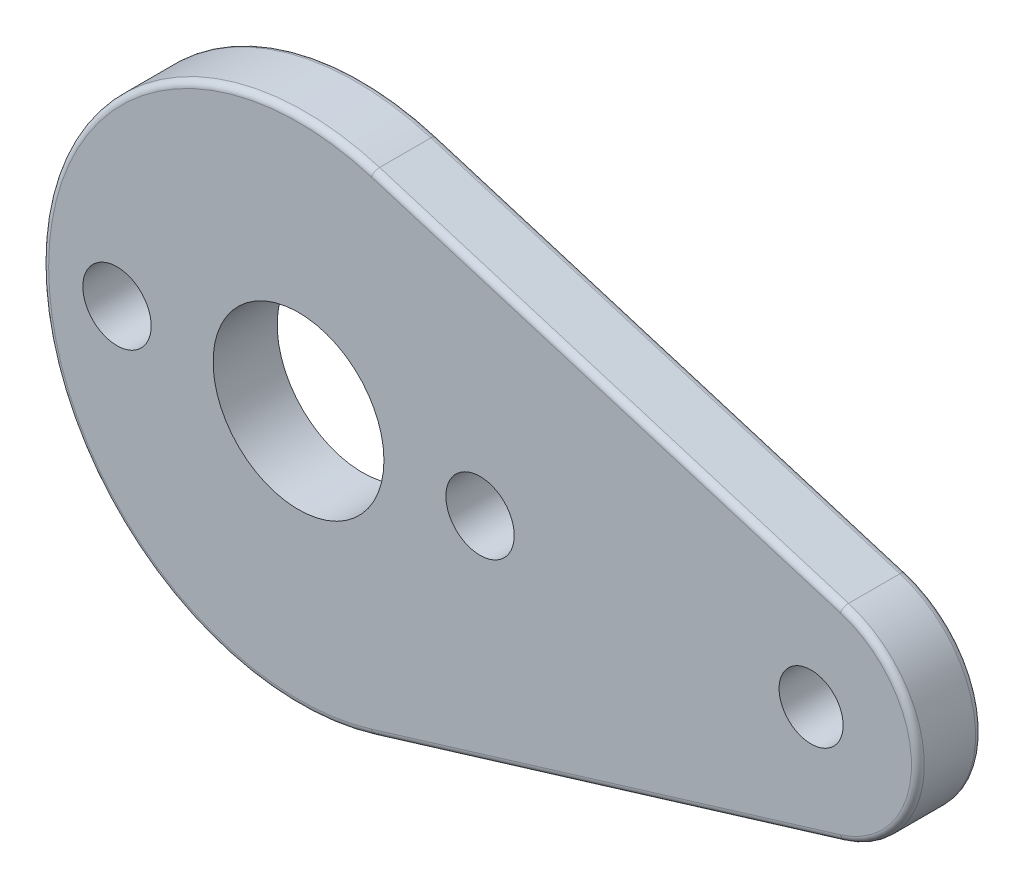
ISO-10303-21;
HEADER;
FILE_DESCRIPTION(('STEP AP214'),'2;1');
FILE_NAME('part.step','',(''),(''),'','','');
FILE_SCHEMA(('AUTOMOTIVE_DESIGN { 1 0 10303 214 1 1 1 1 }'));
ENDSEC;
DATA;
#1=APPLICATION_CONTEXT('core data for automotive mechanical design processes');
#2=APPLICATION_PROTOCOL_DEFINITION('international standard','automotive_design',2000,#1);
#3=PRODUCT_CONTEXT('',#1,'mechanical');
#4=PRODUCT('Part','Part','',(#3));
#5=PRODUCT_RELATED_PRODUCT_CATEGORY('part','',(#4));
#6=PRODUCT_DEFINITION_FORMATION('','',#4);
#7=PRODUCT_DEFINITION_CONTEXT('part definition',#1,'design');
#8=PRODUCT_DEFINITION('design','',#6,#7);
#9=PRODUCT_DEFINITION_SHAPE('','',#8);
#10=(LENGTH_UNIT() NAMED_UNIT(*) SI_UNIT(.MILLI.,.METRE.));
#11=(NAMED_UNIT(*) PLANE_ANGLE_UNIT() SI_UNIT($,.RADIAN.));
#12=(NAMED_UNIT(*) SI_UNIT($,.STERADIAN.) SOLID_ANGLE_UNIT());
#13=UNCERTAINTY_MEASURE_WITH_UNIT(LENGTH_MEASURE(1.E-05),#10,'distance_accuracy_value','');
#14=(GEOMETRIC_REPRESENTATION_CONTEXT(3) GLOBAL_UNCERTAINTY_ASSIGNED_CONTEXT((#13)) GLOBAL_UNIT_ASSIGNED_CONTEXT((#10,
#11,#12)) REPRESENTATION_CONTEXT('',''));
#15=CARTESIAN_POINT('',(0.,0.,0.));
#16=DIRECTION('',(0.,0.,1.));
#17=DIRECTION('',(1.,0.,0.));
#18=AXIS2_PLACEMENT_3D('',#15,#16,#17);
#19=CARTESIAN_POINT('',(0.,0.,3.));
#20=DIRECTION('',(0.,0.,-1.));
#21=DIRECTION('',(-1.,0.,0.));
#22=AXIS2_PLACEMENT_3D('',#19,#20,#21);
#23=PLANE('',#22);
#24=DIRECTION('',(-0.956520023604083,0.291666666666667,0.));
#25=VECTOR('',#24,1.);
#26=CARTESIAN_POINT('',(3.4125,11.1912842761678,3.));
#27=LINE('',#26,#25);
#28=CARTESIAN_POINT('',(25.3708333333333,4.49564411093919,3.));
#29=VERTEX_POINT('',#28);
#30=CARTESIAN_POINT('',(3.4125,11.1912842761678,3.));
#31=VERTEX_POINT('',#30);
#32=EDGE_CURVE('E49',#29,#31,#27,.T.);
#33=ORIENTED_EDGE('',*,*,#32,.T.);
#34=CARTESIAN_POINT('',(0.,0.,3.));
#35=DIRECTION('',(0.,0.,-1.));
#36=DIRECTION('',(-1.,0.,0.));
#37=AXIS2_PLACEMENT_3D('',#34,#35,#36);
#38=CIRCLE('',#37,11.7);
#39=CARTESIAN_POINT('',(3.4125,-11.1912842761678,3.));
#40=VERTEX_POINT('',#39);
#41=EDGE_CURVE('E108',#31,#40,#38,.F.);
#42=ORIENTED_EDGE('',*,*,#41,.T.);
#43=DIRECTION('',(0.956520023604083,0.291666666666667,0.));
#44=VECTOR('',#43,1.);
#45=CARTESIAN_POINT('',(3.4125,-11.1912842761678,3.));
#46=LINE('',#45,#44);
#47=CARTESIAN_POINT('',(25.3708333333333,-4.49564411093919,3.));
#48=VERTEX_POINT('',#47);
#49=EDGE_CURVE('E130',#40,#48,#46,.T.);
#50=ORIENTED_EDGE('',*,*,#49,.T.);
#51=CARTESIAN_POINT('',(24.,0.,3.));
#52=DIRECTION('',(0.,0.,-1.));
#53=DIRECTION('',(-1.,0.,0.));
#54=AXIS2_PLACEMENT_3D('',#51,#52,#53);
#55=CIRCLE('',#54,4.7);
#56=EDGE_CURVE('E54',#48,#29,#55,.F.);
#57=ORIENTED_EDGE('',*,*,#56,.T.);
#58=EDGE_LOOP('',(#33,#42,#50,#57));
#59=FACE_BOUND('',#58,.T.);
#60=CARTESIAN_POINT('',(0.,0.,3.));
#61=DIRECTION('',(0.,0.,1.));
#62=DIRECTION('',(1.,0.,0.));
#63=AXIS2_PLACEMENT_3D('',#60,#61,#62);
#64=CIRCLE('',#63,4.);
#65=CARTESIAN_POINT('',(4.,0.,3.));
#66=VERTEX_POINT('',#65);
#67=EDGE_CURVE('E179',#66,#66,#64,.T.);
#68=ORIENTED_EDGE('',*,*,#67,.F.);
#69=EDGE_LOOP('',(#68));
#70=FACE_BOUND('',#69,.T.);
#71=CARTESIAN_POINT('',(24.,0.,3.));
#72=DIRECTION('',(0.,0.,1.));
#73=DIRECTION('',(1.,0.,0.));
#74=AXIS2_PLACEMENT_3D('',#71,#72,#73);
#75=CIRCLE('',#74,1.5);
#76=CARTESIAN_POINT('',(25.5,0.,3.));
#77=VERTEX_POINT('',#76);
#78=EDGE_CURVE('E173',#77,#77,#75,.T.);
#79=ORIENTED_EDGE('',*,*,#78,.F.);
#80=EDGE_LOOP('',(#79));
#81=FACE_BOUND('',#80,.T.);
#82=CARTESIAN_POINT('',(-8.5,0.,3.));
#83=DIRECTION('',(0.,0.,1.));
#84=DIRECTION('',(1.,0.,0.));
#85=AXIS2_PLACEMENT_3D('',#82,#83,#84);
#86=CIRCLE('',#85,1.6);
#87=CARTESIAN_POINT('',(-6.9,0.,3.));
#88=VERTEX_POINT('',#87);
#89=EDGE_CURVE('E167',#88,#88,#86,.T.);
#90=ORIENTED_EDGE('',*,*,#89,.F.);
#91=EDGE_LOOP('',(#90));
#92=FACE_BOUND('',#91,.T.);
#93=CARTESIAN_POINT('',(8.5,0.,3.));
#94=DIRECTION('',(0.,0.,1.));
#95=DIRECTION('',(-1.,0.,0.));
#96=AXIS2_PLACEMENT_3D('',#93,#94,#95);
#97=CIRCLE('',#96,1.6);
#98=CARTESIAN_POINT('',(6.9,0.,3.));
#99=VERTEX_POINT('',#98);
#100=EDGE_CURVE('E159',#99,#99,#97,.T.);
#101=ORIENTED_EDGE('',*,*,#100,.F.);
#102=EDGE_LOOP('',(#101));
#103=FACE_BOUND('',#102,.T.);
#104=ADVANCED_FACE('F32',(#59,#70,#81,#92,#103),#23,.F.);
#105=CARTESIAN_POINT('',(0.,0.,0.));
#106=DIRECTION('',(0.,0.,-1.));
#107=DIRECTION('',(-1.,0.,0.));
#108=AXIS2_PLACEMENT_3D('',#105,#106,#107);
#109=PLANE('',#108);
#110=DIRECTION('',(0.956520023604083,0.291666666666667,0.));
#111=VECTOR('',#110,1.);
#112=CARTESIAN_POINT('',(3.4125,-11.1912842761678,0.));
#113=LINE('',#112,#111);
#114=CARTESIAN_POINT('',(25.3708333333333,-4.49564411093919,0.));
#115=VERTEX_POINT('',#114);
#116=CARTESIAN_POINT('',(3.4125,-11.1912842761678,0.));
#117=VERTEX_POINT('',#116);
#118=EDGE_CURVE('E191',#115,#117,#113,.F.);
#119=ORIENTED_EDGE('',*,*,#118,.T.);
#120=CARTESIAN_POINT('',(0.,0.,0.));
#121=DIRECTION('',(0.,0.,-1.));
#122=DIRECTION('',(-1.,0.,0.));
#123=AXIS2_PLACEMENT_3D('',#120,#121,#122);
#124=CIRCLE('',#123,11.7);
#125=CARTESIAN_POINT('',(3.4125,11.1912842761678,0.));
#126=VERTEX_POINT('',#125);
#127=EDGE_CURVE('E197',#117,#126,#124,.T.);
#128=ORIENTED_EDGE('',*,*,#127,.T.);
#129=DIRECTION('',(-0.956520023604083,0.291666666666667,0.));
#130=VECTOR('',#129,1.);
#131=CARTESIAN_POINT('',(25.3708333333333,4.49564411093919,0.));
#132=LINE('',#131,#130);
#133=CARTESIAN_POINT('',(25.3708333333333,4.49564411093919,0.));
#134=VERTEX_POINT('',#133);
#135=EDGE_CURVE('E195',#126,#134,#132,.F.);
#136=ORIENTED_EDGE('',*,*,#135,.T.);
#137=CARTESIAN_POINT('',(24.,0.,0.));
#138=DIRECTION('',(0.,0.,-1.));
#139=DIRECTION('',(-1.,0.,0.));
#140=AXIS2_PLACEMENT_3D('',#137,#138,#139);
#141=CIRCLE('',#140,4.7);
#142=EDGE_CURVE('E193',#134,#115,#141,.T.);
#143=ORIENTED_EDGE('',*,*,#142,.T.);
#144=EDGE_LOOP('',(#119,#128,#136,#143));
#145=FACE_BOUND('',#144,.T.);
#146=CARTESIAN_POINT('',(-8.5,0.,0.));
#147=DIRECTION('',(0.,0.,1.));
#148=DIRECTION('',(1.,0.,0.));
#149=AXIS2_PLACEMENT_3D('',#146,#147,#148);
#150=CIRCLE('',#149,1.6);
#151=CARTESIAN_POINT('',(-6.9,0.,0.));
#152=VERTEX_POINT('',#151);
#153=EDGE_CURVE('E164',#152,#152,#150,.T.);
#154=ORIENTED_EDGE('',*,*,#153,.T.);
#155=EDGE_LOOP('',(#154));
#156=FACE_BOUND('',#155,.T.);
#157=CARTESIAN_POINT('',(0.,0.,0.));
#158=DIRECTION('',(0.,0.,1.));
#159=DIRECTION('',(1.,0.,0.));
#160=AXIS2_PLACEMENT_3D('',#157,#158,#159);
#161=CIRCLE('',#160,4.);
#162=CARTESIAN_POINT('',(4.,0.,0.));
#163=VERTEX_POINT('',#162);
#164=EDGE_CURVE('E176',#163,#163,#161,.T.);
#165=ORIENTED_EDGE('',*,*,#164,.T.);
#166=EDGE_LOOP('',(#165));
#167=FACE_BOUND('',#166,.T.);
#168=CARTESIAN_POINT('',(24.,0.,0.));
#169=DIRECTION('',(0.,0.,1.));
#170=DIRECTION('',(1.,0.,0.));
#171=AXIS2_PLACEMENT_3D('',#168,#169,#170);
#172=CIRCLE('',#171,1.5);
#173=CARTESIAN_POINT('',(25.5,0.,0.));
#174=VERTEX_POINT('',#173);
#175=EDGE_CURVE('E170',#174,#174,#172,.T.);
#176=ORIENTED_EDGE('',*,*,#175,.T.);
#177=EDGE_LOOP('',(#176));
#178=FACE_BOUND('',#177,.T.);
#179=CARTESIAN_POINT('',(8.5,0.,0.));
#180=DIRECTION('',(0.,0.,1.));
#181=DIRECTION('',(-1.,0.,0.));
#182=AXIS2_PLACEMENT_3D('',#179,#180,#181);
#183=CIRCLE('',#182,1.6);
#184=CARTESIAN_POINT('',(6.9,0.,0.));
#185=VERTEX_POINT('',#184);
#186=EDGE_CURVE('E153',#185,#185,#183,.T.);
#187=ORIENTED_EDGE('',*,*,#186,.T.);
#188=EDGE_LOOP('',(#187));
#189=FACE_BOUND('',#188,.T.);
#190=ADVANCED_FACE('F237',(#145,#156,#167,#178,#189),#109,.T.);
#191=CARTESIAN_POINT('',(0.,0.,3.));
#192=DIRECTION('',(0.,0.,-1.));
#193=DIRECTION('',(-1.,0.,0.));
#194=AXIS2_PLACEMENT_3D('',#191,#192,#193);
#195=CYLINDRICAL_SURFACE('',#194,12.);
#196=DIRECTION('',(0.,0.,-1.));
#197=VECTOR('',#196,1.);
#198=CARTESIAN_POINT('',(3.5,11.478240283249,3.));
#199=LINE('',#198,#197);
#200=CARTESIAN_POINT('',(3.5,11.478240283249,2.7));
#201=VERTEX_POINT('',#200);
#202=CARTESIAN_POINT('',(3.5,11.478240283249,0.3));
#203=VERTEX_POINT('',#202);
#204=EDGE_CURVE('E182',#201,#203,#199,.T.);
#205=ORIENTED_EDGE('',*,*,#204,.T.);
#206=CARTESIAN_POINT('',(0.,0.,0.3));
#207=DIRECTION('',(0.,0.,-1.));
#208=DIRECTION('',(-1.,0.,0.));
#209=AXIS2_PLACEMENT_3D('',#206,#207,#208);
#210=CIRCLE('',#209,12.);
#211=CARTESIAN_POINT('',(3.5,-11.478240283249,0.3));
#212=VERTEX_POINT('',#211);
#213=EDGE_CURVE('E119',#203,#212,#210,.F.);
#214=ORIENTED_EDGE('',*,*,#213,.T.);
#215=DIRECTION('',(0.,0.,-1.));
#216=VECTOR('',#215,1.);
#217=CARTESIAN_POINT('',(3.5,-11.478240283249,3.));
#218=LINE('',#217,#216);
#219=CARTESIAN_POINT('',(3.5,-11.478240283249,2.7));
#220=VERTEX_POINT('',#219);
#221=EDGE_CURVE('E101',#220,#212,#218,.T.);
#222=ORIENTED_EDGE('',*,*,#221,.F.);
#223=CARTESIAN_POINT('',(0.,0.,2.7));
#224=DIRECTION('',(0.,0.,-1.));
#225=DIRECTION('',(-1.,0.,0.));
#226=AXIS2_PLACEMENT_3D('',#223,#224,#225);
#227=CIRCLE('',#226,12.);
#228=EDGE_CURVE('E116',#220,#201,#227,.T.);
#229=ORIENTED_EDGE('',*,*,#228,.T.);
#230=EDGE_LOOP('',(#205,#214,#222,#229));
#231=FACE_BOUND('',#230,.T.);
#232=ADVANCED_FACE('F115',(#231),#195,.T.);
#233=CARTESIAN_POINT('',(25.4583333333333,-4.78260011802042,3.));
#234=DIRECTION('',(-0.291666666666667,0.956520023604083,0.));
#235=DIRECTION('',(-0.956520023604083,-0.291666666666667,0.));
#236=AXIS2_PLACEMENT_3D('',#233,#234,#235);
#237=PLANE('',#236);
#238=ORIENTED_EDGE('',*,*,#221,.T.);
#239=DIRECTION('',(0.956520023604083,0.291666666666667,0.));
#240=VECTOR('',#239,1.);
#241=CARTESIAN_POINT('',(25.4583333333333,-4.78260011802042,0.3));
#242=LINE('',#241,#240);
#243=CARTESIAN_POINT('',(25.4583333333333,-4.78260011802041,0.3));
#244=VERTEX_POINT('',#243);
#245=EDGE_CURVE('E11',#212,#244,#242,.T.);
#246=ORIENTED_EDGE('',*,*,#245,.T.);
#247=DIRECTION('',(0.,0.,-1.));
#248=VECTOR('',#247,1.);
#249=CARTESIAN_POINT('',(25.4583333333333,-4.78260011802041,3.));
#250=LINE('',#249,#248);
#251=CARTESIAN_POINT('',(25.4583333333333,-4.78260011802041,2.7));
#252=VERTEX_POINT('',#251);
#253=EDGE_CURVE('E103',#252,#244,#250,.T.);
#254=ORIENTED_EDGE('',*,*,#253,.F.);
#255=DIRECTION('',(0.956520023604083,0.291666666666667,0.));
#256=VECTOR('',#255,1.);
#257=CARTESIAN_POINT('',(25.4583333333333,-4.78260011802042,2.7));
#258=LINE('',#257,#256);
#259=EDGE_CURVE('E41',#252,#220,#258,.F.);
#260=ORIENTED_EDGE('',*,*,#259,.T.);
#261=EDGE_LOOP('',(#238,#246,#254,#260));
#262=FACE_BOUND('',#261,.T.);
#263=ADVANCED_FACE('F100',(#262),#237,.F.);
#264=CARTESIAN_POINT('',(24.,0.,3.));
#265=DIRECTION('',(0.,0.,-1.));
#266=DIRECTION('',(-1.,0.,0.));
#267=AXIS2_PLACEMENT_3D('',#264,#265,#266);
#268=CYLINDRICAL_SURFACE('',#267,5.);
#269=ORIENTED_EDGE('',*,*,#253,.T.);
#270=CARTESIAN_POINT('',(24.,0.,0.3));
#271=DIRECTION('',(0.,0.,-1.));
#272=DIRECTION('',(-1.,0.,0.));
#273=AXIS2_PLACEMENT_3D('',#270,#271,#272);
#274=CIRCLE('',#273,5.);
#275=CARTESIAN_POINT('',(25.4583333333333,4.78260011802041,0.3));
#276=VERTEX_POINT('',#275);
#277=EDGE_CURVE('E206',#244,#276,#274,.F.);
#278=ORIENTED_EDGE('',*,*,#277,.T.);
#279=DIRECTION('',(0.,0.,-1.));
#280=VECTOR('',#279,1.);
#281=CARTESIAN_POINT('',(25.4583333333333,4.78260011802041,3.));
#282=LINE('',#281,#280);
#283=CARTESIAN_POINT('',(25.4583333333333,4.78260011802041,2.7));
#284=VERTEX_POINT('',#283);
#285=EDGE_CURVE('E186',#284,#276,#282,.T.);
#286=ORIENTED_EDGE('',*,*,#285,.F.);
#287=CARTESIAN_POINT('',(24.,0.,2.7));
#288=DIRECTION('',(0.,0.,-1.));
#289=DIRECTION('',(-1.,0.,0.));
#290=AXIS2_PLACEMENT_3D('',#287,#288,#289);
#291=CIRCLE('',#290,5.);
#292=EDGE_CURVE('E204',#284,#252,#291,.T.);
#293=ORIENTED_EDGE('',*,*,#292,.T.);
#294=EDGE_LOOP('',(#269,#278,#286,#293));
#295=FACE_BOUND('',#294,.T.);
#296=ADVANCED_FACE('F219',(#295),#268,.T.);
#297=CARTESIAN_POINT('',(3.5,11.478240283249,3.));
#298=DIRECTION('',(-0.291666666666667,-0.956520023604083,0.));
#299=DIRECTION('',(0.956520023604083,-0.291666666666667,0.));
#300=AXIS2_PLACEMENT_3D('',#297,#298,#299);
#301=PLANE('',#300);
#302=ORIENTED_EDGE('',*,*,#285,.T.);
#303=DIRECTION('',(-0.956520023604083,0.291666666666667,0.));
#304=VECTOR('',#303,1.);
#305=CARTESIAN_POINT('',(3.5,11.478240283249,0.3));
#306=LINE('',#305,#304);
#307=EDGE_CURVE('E202',#276,#203,#306,.T.);
#308=ORIENTED_EDGE('',*,*,#307,.T.);
#309=ORIENTED_EDGE('',*,*,#204,.F.);
#310=DIRECTION('',(-0.956520023604083,0.291666666666667,0.));
#311=VECTOR('',#310,1.);
#312=CARTESIAN_POINT('',(3.5,11.478240283249,2.7));
#313=LINE('',#312,#311);
#314=EDGE_CURVE('E200',#201,#284,#313,.F.);
#315=ORIENTED_EDGE('',*,*,#314,.T.);
#316=EDGE_LOOP('',(#302,#308,#309,#315));
#317=FACE_BOUND('',#316,.T.);
#318=ADVANCED_FACE('F217',(#317),#301,.F.);
#319=CARTESIAN_POINT('',(0.,0.,3.));
#320=DIRECTION('',(0.,0.,-1.));
#321=DIRECTION('',(-1.,0.,0.));
#322=AXIS2_PLACEMENT_3D('',#319,#320,#321);
#323=CYLINDRICAL_SURFACE('',#322,4.);
#324=ORIENTED_EDGE('',*,*,#67,.T.);
#325=EDGE_LOOP('',(#324));
#326=FACE_BOUND('',#325,.T.);
#327=ORIENTED_EDGE('',*,*,#164,.F.);
#328=EDGE_LOOP('',(#327));
#329=FACE_BOUND('',#328,.T.);
#330=ADVANCED_FACE('F245',(#326,#329),#323,.F.);
#331=CARTESIAN_POINT('',(24.,0.,3.));
#332=DIRECTION('',(0.,0.,-1.));
#333=DIRECTION('',(-1.,0.,0.));
#334=AXIS2_PLACEMENT_3D('',#331,#332,#333);
#335=CYLINDRICAL_SURFACE('',#334,1.5);
#336=ORIENTED_EDGE('',*,*,#78,.T.);
#337=EDGE_LOOP('',(#336));
#338=FACE_BOUND('',#337,.T.);
#339=ORIENTED_EDGE('',*,*,#175,.F.);
#340=EDGE_LOOP('',(#339));
#341=FACE_BOUND('',#340,.T.);
#342=ADVANCED_FACE('F277',(#338,#341),#335,.F.);
#343=CARTESIAN_POINT('',(-8.5,0.,3.));
#344=DIRECTION('',(0.,0.,-1.));
#345=DIRECTION('',(-1.,0.,0.));
#346=AXIS2_PLACEMENT_3D('',#343,#344,#345);
#347=CYLINDRICAL_SURFACE('',#346,1.6);
#348=ORIENTED_EDGE('',*,*,#89,.T.);
#349=EDGE_LOOP('',(#348));
#350=FACE_BOUND('',#349,.T.);
#351=ORIENTED_EDGE('',*,*,#153,.F.);
#352=EDGE_LOOP('',(#351));
#353=FACE_BOUND('',#352,.T.);
#354=ADVANCED_FACE('F284',(#350,#353),#347,.F.);
#355=CARTESIAN_POINT('',(8.5,0.,3.));
#356=DIRECTION('',(0.,0.,-1.));
#357=DIRECTION('',(-1.,0.,0.));
#358=AXIS2_PLACEMENT_3D('',#355,#356,#357);
#359=CYLINDRICAL_SURFACE('',#358,1.6);
#360=ORIENTED_EDGE('',*,*,#100,.T.);
#361=EDGE_LOOP('',(#360));
#362=FACE_BOUND('',#361,.T.);
#363=ORIENTED_EDGE('',*,*,#186,.F.);
#364=EDGE_LOOP('',(#363));
#365=FACE_BOUND('',#364,.T.);
#366=ADVANCED_FACE('F291',(#362,#365),#359,.F.);
#367=CARTESIAN_POINT('',(24.,0.,0.3));
#368=DIRECTION('',(0.,0.,-1.));
#369=DIRECTION('',(-1.,0.,0.));
#370=AXIS2_PLACEMENT_3D('',#367,#368,#369);
#371=TOROIDAL_SURFACE('',#370,4.7,0.3);
#372=CARTESIAN_POINT('',(25.3708333333333,-4.49564411093919,0.3));
#373=DIRECTION('',(-0.956520023604082,-0.29166666666667,0.));
#374=DIRECTION('',(0.29166666666667,-0.956520023604082,0.));
#375=AXIS2_PLACEMENT_3D('',#372,#373,#374);
#376=CIRCLE('',#375,0.3);
#377=EDGE_CURVE('E146',#115,#244,#376,.T.);
#378=ORIENTED_EDGE('',*,*,#377,.F.);
#379=ORIENTED_EDGE('',*,*,#142,.F.);
#380=CARTESIAN_POINT('',(25.3708333333333,4.49564411093919,0.3));
#381=DIRECTION('',(-0.956520023604082,0.291666666666669,0.));
#382=DIRECTION('',(-0.291666666666669,-0.956520023604083,0.));
#383=AXIS2_PLACEMENT_3D('',#380,#381,#382);
#384=CIRCLE('',#383,0.3);
#385=EDGE_CURVE('E135',#276,#134,#384,.T.);
#386=ORIENTED_EDGE('',*,*,#385,.F.);
#387=ORIENTED_EDGE('',*,*,#277,.F.);
#388=EDGE_LOOP('',(#378,#379,#386,#387));
#389=FACE_BOUND('',#388,.T.);
#390=ADVANCED_FACE('F222',(#389),#371,.T.);
#391=CARTESIAN_POINT('',(3.4125,11.1912842761678,0.3));
#392=DIRECTION('',(0.956520023604083,-0.291666666666667,0.));
#393=DIRECTION('',(0.291666666666667,0.956520023604083,0.));
#394=AXIS2_PLACEMENT_3D('',#391,#392,#393);
#395=CYLINDRICAL_SURFACE('',#394,0.3);
#396=ORIENTED_EDGE('',*,*,#385,.T.);
#397=ORIENTED_EDGE('',*,*,#135,.F.);
#398=CARTESIAN_POINT('',(3.4125,11.1912842761678,0.3));
#399=DIRECTION('',(-0.956520023604083,0.291666666666667,0.));
#400=DIRECTION('',(-0.291666666666667,-0.956520023604083,0.));
#401=AXIS2_PLACEMENT_3D('',#398,#399,#400);
#402=CIRCLE('',#401,0.3);
#403=EDGE_CURVE('E140',#203,#126,#402,.T.);
#404=ORIENTED_EDGE('',*,*,#403,.F.);
#405=ORIENTED_EDGE('',*,*,#307,.F.);
#406=EDGE_LOOP('',(#396,#397,#404,#405));
#407=FACE_BOUND('',#406,.T.);
#408=ADVANCED_FACE('F225',(#407),#395,.T.);
#409=CARTESIAN_POINT('',(25.3708333333333,-4.49564411093919,0.3));
#410=DIRECTION('',(-0.956520023604083,-0.291666666666667,0.));
#411=DIRECTION('',(0.291666666666667,-0.956520023604083,0.));
#412=AXIS2_PLACEMENT_3D('',#409,#410,#411);
#413=CYLINDRICAL_SURFACE('',#412,0.3);
#414=ORIENTED_EDGE('',*,*,#377,.T.);
#415=ORIENTED_EDGE('',*,*,#245,.F.);
#416=CARTESIAN_POINT('',(3.4125,-11.1912842761678,0.3));
#417=DIRECTION('',(-0.956520023604083,-0.291666666666667,0.));
#418=DIRECTION('',(0.291666666666667,-0.956520023604083,0.));
#419=AXIS2_PLACEMENT_3D('',#416,#417,#418);
#420=CIRCLE('',#419,0.3);
#421=EDGE_CURVE('E138',#117,#212,#420,.T.);
#422=ORIENTED_EDGE('',*,*,#421,.F.);
#423=ORIENTED_EDGE('',*,*,#118,.F.);
#424=EDGE_LOOP('',(#414,#415,#422,#423));
#425=FACE_BOUND('',#424,.T.);
#426=ADVANCED_FACE('F228',(#425),#413,.T.);
#427=CARTESIAN_POINT('',(0.,0.,0.3));
#428=DIRECTION('',(0.,0.,-1.));
#429=DIRECTION('',(-1.,0.,0.));
#430=AXIS2_PLACEMENT_3D('',#427,#428,#429);
#431=TOROIDAL_SURFACE('',#430,11.7,0.3);
#432=ORIENTED_EDGE('',*,*,#403,.T.);
#433=ORIENTED_EDGE('',*,*,#127,.F.);
#434=ORIENTED_EDGE('',*,*,#421,.T.);
#435=ORIENTED_EDGE('',*,*,#213,.F.);
#436=EDGE_LOOP('',(#432,#433,#434,#435));
#437=FACE_BOUND('',#436,.T.);
#438=ADVANCED_FACE('F226',(#437),#431,.T.);
#439=CARTESIAN_POINT('',(24.,0.,2.7));
#440=DIRECTION('',(0.,0.,-1.));
#441=DIRECTION('',(-1.,0.,0.));
#442=AXIS2_PLACEMENT_3D('',#439,#440,#441);
#443=TOROIDAL_SURFACE('',#442,4.7,0.3);
#444=CARTESIAN_POINT('',(25.3708333333333,-4.49564411093919,2.7));
#445=DIRECTION('',(-0.956520023604082,-0.291666666666669,0.));
#446=DIRECTION('',(0.291666666666669,-0.956520023604083,0.));
#447=AXIS2_PLACEMENT_3D('',#444,#445,#446);
#448=CIRCLE('',#447,0.3);
#449=EDGE_CURVE('E132',#252,#48,#448,.T.);
#450=ORIENTED_EDGE('',*,*,#449,.F.);
#451=ORIENTED_EDGE('',*,*,#292,.F.);
#452=CARTESIAN_POINT('',(25.3708333333333,4.49564411093919,2.7));
#453=DIRECTION('',(-0.956520023604082,0.29166666666667,0.));
#454=DIRECTION('',(-0.29166666666667,-0.956520023604082,0.));
#455=AXIS2_PLACEMENT_3D('',#452,#453,#454);
#456=CIRCLE('',#455,0.3);
#457=EDGE_CURVE('E36',#29,#284,#456,.T.);
#458=ORIENTED_EDGE('',*,*,#457,.F.);
#459=ORIENTED_EDGE('',*,*,#56,.F.);
#460=EDGE_LOOP('',(#450,#451,#458,#459));
#461=FACE_BOUND('',#460,.T.);
#462=ADVANCED_FACE('F34',(#461),#443,.T.);
#463=CARTESIAN_POINT('',(3.4125,11.1912842761678,2.7));
#464=DIRECTION('',(-0.956520023604083,0.291666666666667,0.));
#465=DIRECTION('',(-0.291666666666667,-0.956520023604083,0.));
#466=AXIS2_PLACEMENT_3D('',#463,#464,#465);
#467=CYLINDRICAL_SURFACE('',#466,0.3);
#468=ORIENTED_EDGE('',*,*,#457,.T.);
#469=ORIENTED_EDGE('',*,*,#314,.F.);
#470=CARTESIAN_POINT('',(3.4125,11.1912842761678,2.7));
#471=DIRECTION('',(-0.956520023604083,0.291666666666667,0.));
#472=DIRECTION('',(-0.291666666666667,-0.956520023604083,0.));
#473=AXIS2_PLACEMENT_3D('',#470,#471,#472);
#474=CIRCLE('',#473,0.3);
#475=EDGE_CURVE('E126',#31,#201,#474,.T.);
#476=ORIENTED_EDGE('',*,*,#475,.F.);
#477=ORIENTED_EDGE('',*,*,#32,.F.);
#478=EDGE_LOOP('',(#468,#469,#476,#477));
#479=FACE_BOUND('',#478,.T.);
#480=ADVANCED_FACE('F214',(#479),#467,.T.);
#481=CARTESIAN_POINT('',(3.4125,-11.1912842761678,2.7));
#482=DIRECTION('',(0.956520023604083,0.291666666666667,0.));
#483=DIRECTION('',(-0.291666666666667,0.956520023604083,0.));
#484=AXIS2_PLACEMENT_3D('',#481,#482,#483);
#485=CYLINDRICAL_SURFACE('',#484,0.3);
#486=ORIENTED_EDGE('',*,*,#449,.T.);
#487=ORIENTED_EDGE('',*,*,#49,.F.);
#488=CARTESIAN_POINT('',(3.4125,-11.1912842761678,2.7));
#489=DIRECTION('',(-0.956520023604083,-0.291666666666667,0.));
#490=DIRECTION('',(0.291666666666667,-0.956520023604083,0.));
#491=AXIS2_PLACEMENT_3D('',#488,#489,#490);
#492=CIRCLE('',#491,0.3);
#493=EDGE_CURVE('E124',#220,#40,#492,.T.);
#494=ORIENTED_EDGE('',*,*,#493,.F.);
#495=ORIENTED_EDGE('',*,*,#259,.F.);
#496=EDGE_LOOP('',(#486,#487,#494,#495));
#497=FACE_BOUND('',#496,.T.);
#498=ADVANCED_FACE('F129',(#497),#485,.T.);
#499=CARTESIAN_POINT('',(0.,0.,2.7));
#500=DIRECTION('',(0.,0.,-1.));
#501=DIRECTION('',(-1.,0.,0.));
#502=AXIS2_PLACEMENT_3D('',#499,#500,#501);
#503=TOROIDAL_SURFACE('',#502,11.7,0.3);
#504=ORIENTED_EDGE('',*,*,#475,.T.);
#505=ORIENTED_EDGE('',*,*,#228,.F.);
#506=ORIENTED_EDGE('',*,*,#493,.T.);
#507=ORIENTED_EDGE('',*,*,#41,.F.);
#508=EDGE_LOOP('',(#504,#505,#506,#507));
#509=FACE_BOUND('',#508,.T.);
#510=ADVANCED_FACE('F122',(#509),#503,.T.);
#511=CLOSED_SHELL('',(#104,#190,#232,#263,#296,#318,#330,#342,#354,#366,#390,#408,#426,#438,
#462,#480,#498,#510));
#512=MANIFOLD_SOLID_BREP('B2',#511);
#513=ADVANCED_BREP_SHAPE_REPRESENTATION('',(#18,#512),#14);
#514=SHAPE_DEFINITION_REPRESENTATION(#9,#513);
ENDSEC;
END-ISO-10303-21;
